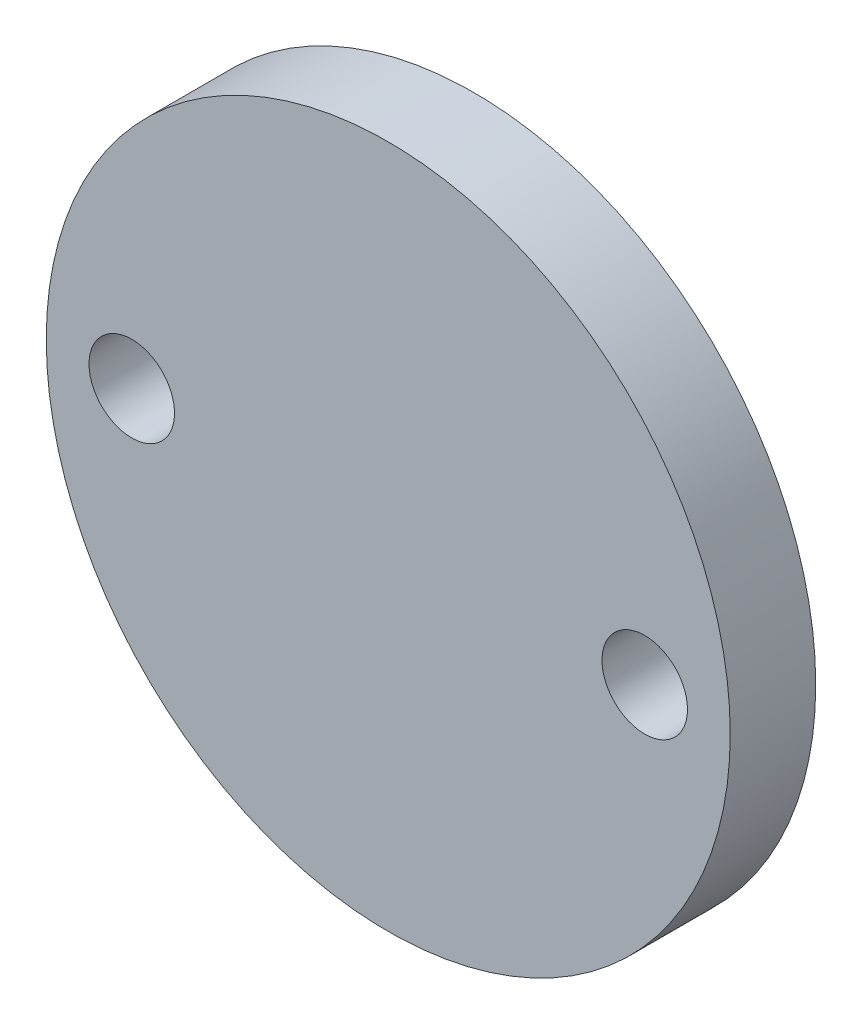
ISO-10303-21;
HEADER;
FILE_DESCRIPTION(('STEP AP214'),'2;1');
FILE_NAME('part.step','',(''),(''),'','','');
FILE_SCHEMA(('AUTOMOTIVE_DESIGN { 1 0 10303 214 1 1 1 1 }'));
ENDSEC;
DATA;
#1=APPLICATION_CONTEXT('core data for automotive mechanical design processes');
#2=APPLICATION_PROTOCOL_DEFINITION('international standard','automotive_design',2000,#1);
#3=PRODUCT_CONTEXT('',#1,'mechanical');
#4=PRODUCT('Part','Part','',(#3));
#5=PRODUCT_RELATED_PRODUCT_CATEGORY('part','',(#4));
#6=PRODUCT_DEFINITION_FORMATION('','',#4);
#7=PRODUCT_DEFINITION_CONTEXT('part definition',#1,'design');
#8=PRODUCT_DEFINITION('design','',#6,#7);
#9=PRODUCT_DEFINITION_SHAPE('','',#8);
#10=(LENGTH_UNIT() NAMED_UNIT(*) SI_UNIT(.MILLI.,.METRE.));
#11=(NAMED_UNIT(*) PLANE_ANGLE_UNIT() SI_UNIT($,.RADIAN.));
#12=(NAMED_UNIT(*) SI_UNIT($,.STERADIAN.) SOLID_ANGLE_UNIT());
#13=UNCERTAINTY_MEASURE_WITH_UNIT(LENGTH_MEASURE(1.E-05),#10,'distance_accuracy_value','');
#14=(GEOMETRIC_REPRESENTATION_CONTEXT(3) GLOBAL_UNCERTAINTY_ASSIGNED_CONTEXT((#13)) GLOBAL_UNIT_ASSIGNED_CONTEXT((#10,
#11,#12)) REPRESENTATION_CONTEXT('',''));
#15=CARTESIAN_POINT('',(0.,0.,0.));
#16=DIRECTION('',(0.,0.,1.));
#17=DIRECTION('',(1.,0.,0.));
#18=AXIS2_PLACEMENT_3D('',#15,#16,#17);
#19=CARTESIAN_POINT('',(0.,0.,10.));
#20=DIRECTION('',(0.,0.,1.));
#21=DIRECTION('',(1.,0.,0.));
#22=AXIS2_PLACEMENT_3D('',#19,#20,#21);
#23=PLANE('',#22);
#24=CARTESIAN_POINT('',(30.,0.,10.));
#25=DIRECTION('',(0.,0.,1.));
#26=DIRECTION('',(1.,0.,0.));
#27=AXIS2_PLACEMENT_3D('',#24,#25,#26);
#28=CIRCLE('',#27,4.99999999999999);
#29=CARTESIAN_POINT('',(35.,0.,10.));
#30=VERTEX_POINT('',#29);
#31=EDGE_CURVE('E43',#30,#30,#28,.T.);
#32=ORIENTED_EDGE('',*,*,#31,.F.);
#33=EDGE_LOOP('',(#32));
#34=FACE_BOUND('',#33,.T.);
#35=CARTESIAN_POINT('',(0.,0.,10.));
#36=DIRECTION('',(0.,0.,1.));
#37=DIRECTION('',(1.,0.,0.));
#38=AXIS2_PLACEMENT_3D('',#35,#36,#37);
#39=CIRCLE('',#38,40.);
#40=CARTESIAN_POINT('',(40.,0.,10.));
#41=VERTEX_POINT('',#40);
#42=EDGE_CURVE('E10',#41,#41,#39,.T.);
#43=ORIENTED_EDGE('',*,*,#42,.T.);
#44=EDGE_LOOP('',(#43));
#45=FACE_BOUND('',#44,.T.);
#46=CARTESIAN_POINT('',(-30.,0.,10.));
#47=DIRECTION('',(0.,0.,1.));
#48=DIRECTION('',(-1.,0.,0.));
#49=AXIS2_PLACEMENT_3D('',#46,#47,#48);
#50=CIRCLE('',#49,4.99999999999999);
#51=CARTESIAN_POINT('',(-35.,0.,10.));
#52=VERTEX_POINT('',#51);
#53=EDGE_CURVE('E48',#52,#52,#50,.T.);
#54=ORIENTED_EDGE('',*,*,#53,.F.);
#55=EDGE_LOOP('',(#54));
#56=FACE_BOUND('',#55,.T.);
#57=ADVANCED_FACE('F32',(#34,#45,#56),#23,.T.);
#58=CARTESIAN_POINT('',(0.,0.,0.));
#59=DIRECTION('',(0.,0.,1.));
#60=DIRECTION('',(1.,0.,0.));
#61=AXIS2_PLACEMENT_3D('',#58,#59,#60);
#62=PLANE('',#61);
#63=CARTESIAN_POINT('',(0.,0.,0.));
#64=DIRECTION('',(0.,0.,1.));
#65=DIRECTION('',(1.,0.,0.));
#66=AXIS2_PLACEMENT_3D('',#63,#64,#65);
#67=CIRCLE('',#66,40.);
#68=CARTESIAN_POINT('',(40.,0.,0.));
#69=VERTEX_POINT('',#68);
#70=EDGE_CURVE('E36',#69,#69,#67,.T.);
#71=ORIENTED_EDGE('',*,*,#70,.F.);
#72=EDGE_LOOP('',(#71));
#73=FACE_BOUND('',#72,.T.);
#74=CARTESIAN_POINT('',(30.,0.,0.));
#75=DIRECTION('',(0.,0.,1.));
#76=DIRECTION('',(1.,0.,0.));
#77=AXIS2_PLACEMENT_3D('',#74,#75,#76);
#78=CIRCLE('',#77,4.99999999999999);
#79=CARTESIAN_POINT('',(35.,0.,0.));
#80=VERTEX_POINT('',#79);
#81=EDGE_CURVE('E45',#80,#80,#78,.T.);
#82=ORIENTED_EDGE('',*,*,#81,.T.);
#83=EDGE_LOOP('',(#82));
#84=FACE_BOUND('',#83,.T.);
#85=CARTESIAN_POINT('',(-30.,0.,0.));
#86=DIRECTION('',(0.,0.,1.));
#87=DIRECTION('',(-1.,0.,0.));
#88=AXIS2_PLACEMENT_3D('',#85,#86,#87);
#89=CIRCLE('',#88,4.99999999999999);
#90=CARTESIAN_POINT('',(-35.,0.,0.));
#91=VERTEX_POINT('',#90);
#92=EDGE_CURVE('E51',#91,#91,#89,.T.);
#93=ORIENTED_EDGE('',*,*,#92,.T.);
#94=EDGE_LOOP('',(#93));
#95=FACE_BOUND('',#94,.T.);
#96=ADVANCED_FACE('F61',(#73,#84,#95),#62,.F.);
#97=CARTESIAN_POINT('',(0.,0.,10.));
#98=DIRECTION('',(0.,0.,-1.));
#99=DIRECTION('',(-1.,0.,0.));
#100=AXIS2_PLACEMENT_3D('',#97,#98,#99);
#101=CYLINDRICAL_SURFACE('',#100,40.);
#102=ORIENTED_EDGE('',*,*,#42,.F.);
#103=EDGE_LOOP('',(#102));
#104=FACE_BOUND('',#103,.T.);
#105=ORIENTED_EDGE('',*,*,#70,.T.);
#106=EDGE_LOOP('',(#105));
#107=FACE_BOUND('',#106,.T.);
#108=ADVANCED_FACE('F34',(#104,#107),#101,.T.);
#109=CARTESIAN_POINT('',(30.,0.,10.));
#110=DIRECTION('',(0.,0.,-1.));
#111=DIRECTION('',(-1.,0.,0.));
#112=AXIS2_PLACEMENT_3D('',#109,#110,#111);
#113=CYLINDRICAL_SURFACE('',#112,4.99999999999999);
#114=ORIENTED_EDGE('',*,*,#31,.T.);
#115=EDGE_LOOP('',(#114));
#116=FACE_BOUND('',#115,.T.);
#117=ORIENTED_EDGE('',*,*,#81,.F.);
#118=EDGE_LOOP('',(#117));
#119=FACE_BOUND('',#118,.T.);
#120=ADVANCED_FACE('F70',(#116,#119),#113,.F.);
#121=CARTESIAN_POINT('',(-30.,0.,10.));
#122=DIRECTION('',(0.,0.,-1.));
#123=DIRECTION('',(-1.,0.,0.));
#124=AXIS2_PLACEMENT_3D('',#121,#122,#123);
#125=CYLINDRICAL_SURFACE('',#124,4.99999999999999);
#126=ORIENTED_EDGE('',*,*,#53,.T.);
#127=EDGE_LOOP('',(#126));
#128=FACE_BOUND('',#127,.T.);
#129=ORIENTED_EDGE('',*,*,#92,.F.);
#130=EDGE_LOOP('',(#129));
#131=FACE_BOUND('',#130,.T.);
#132=ADVANCED_FACE('F57',(#128,#131),#125,.F.);
#133=CLOSED_SHELL('',(#57,#96,#108,#120,#132));
#134=MANIFOLD_SOLID_BREP('B2',#133);
#135=ADVANCED_BREP_SHAPE_REPRESENTATION('',(#18,#134),#14);
#136=SHAPE_DEFINITION_REPRESENTATION(#9,#135);
ENDSEC;
END-ISO-10303-21;
